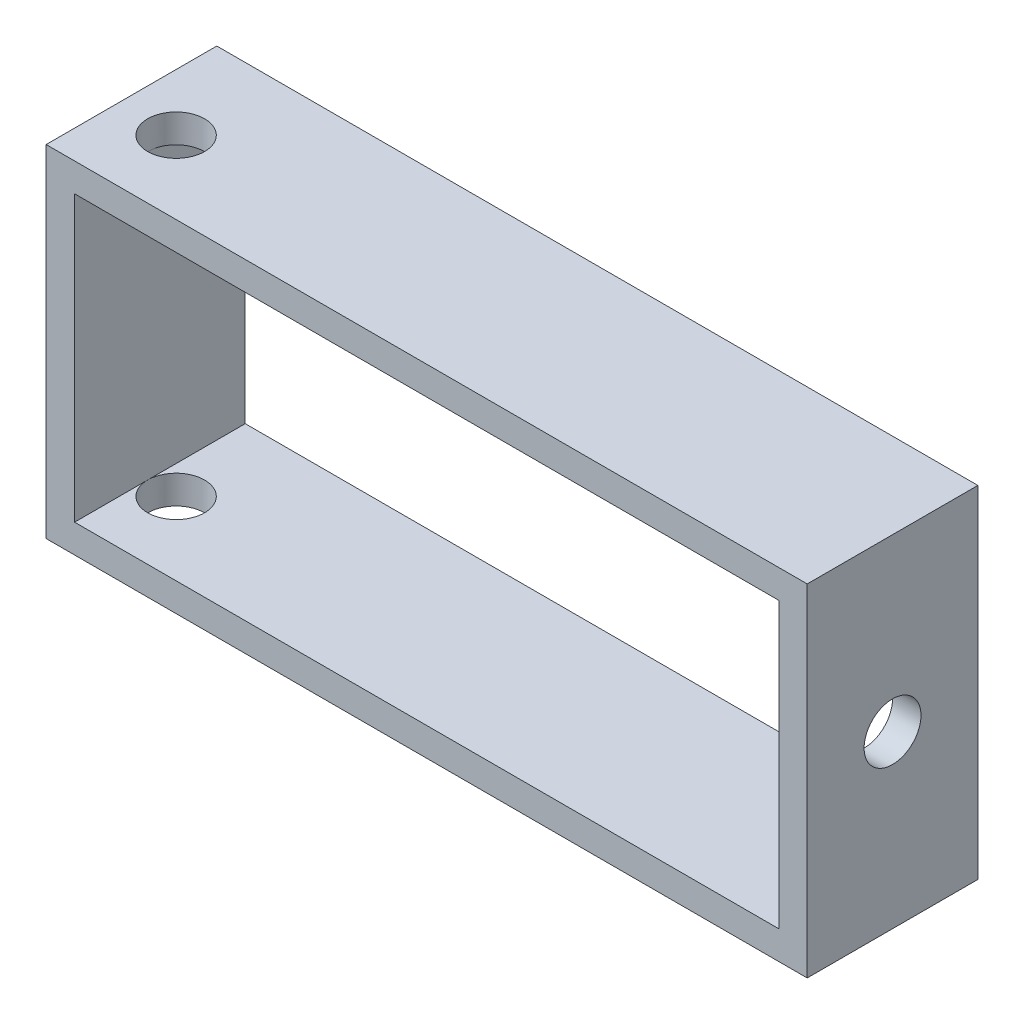
ISO-10303-21;
HEADER;
FILE_DESCRIPTION(('STEP AP214'),'2;1');
FILE_NAME('part.step','',(''),(''),'','','');
FILE_SCHEMA(('AUTOMOTIVE_DESIGN { 1 0 10303 214 1 1 1 1 }'));
ENDSEC;
DATA;
#1=APPLICATION_CONTEXT('core data for automotive mechanical design processes');
#2=APPLICATION_PROTOCOL_DEFINITION('international standard','automotive_design',2000,#1);
#3=PRODUCT_CONTEXT('',#1,'mechanical');
#4=PRODUCT('Part','Part','',(#3));
#5=PRODUCT_RELATED_PRODUCT_CATEGORY('part','',(#4));
#6=PRODUCT_DEFINITION_FORMATION('','',#4);
#7=PRODUCT_DEFINITION_CONTEXT('part definition',#1,'design');
#8=PRODUCT_DEFINITION('design','',#6,#7);
#9=PRODUCT_DEFINITION_SHAPE('','',#8);
#10=(LENGTH_UNIT() NAMED_UNIT(*) SI_UNIT(.MILLI.,.METRE.));
#11=(NAMED_UNIT(*) PLANE_ANGLE_UNIT() SI_UNIT($,.RADIAN.));
#12=(NAMED_UNIT(*) SI_UNIT($,.STERADIAN.) SOLID_ANGLE_UNIT());
#13=UNCERTAINTY_MEASURE_WITH_UNIT(LENGTH_MEASURE(1.E-05),#10,'distance_accuracy_value','');
#14=(GEOMETRIC_REPRESENTATION_CONTEXT(3) GLOBAL_UNCERTAINTY_ASSIGNED_CONTEXT((#13)) GLOBAL_UNIT_ASSIGNED_CONTEXT((#10,
#11,#12)) REPRESENTATION_CONTEXT('',''));
#15=CARTESIAN_POINT('',(0.,0.,0.));
#16=DIRECTION('',(0.,0.,1.));
#17=DIRECTION('',(1.,0.,0.));
#18=AXIS2_PLACEMENT_3D('',#15,#16,#17);
#19=CARTESIAN_POINT('',(-26.5645278612584,60.,-7.49483109232942));
#20=DIRECTION('',(0.,-1.,0.));
#21=DIRECTION('',(0.,0.,-1.));
#22=AXIS2_PLACEMENT_3D('',#19,#20,#21);
#23=CYLINDRICAL_SURFACE('',#22,5.);
#24=CARTESIAN_POINT('',(-26.5645278612584,55.,-7.49483109232942));
#25=DIRECTION('',(0.,1.,0.));
#26=DIRECTION('',(0.,0.,1.));
#27=AXIS2_PLACEMENT_3D('',#24,#25,#26);
#28=CIRCLE('',#27,5.);
#29=CARTESIAN_POINT('',(-31.5645278612584,55.,-7.49483109232942));
#30=VERTEX_POINT('',#29);
#31=EDGE_CURVE('E11',#30,#30,#28,.T.);
#32=ORIENTED_EDGE('',*,*,#31,.F.);
#33=EDGE_LOOP('',(#32));
#34=FACE_BOUND('',#33,.T.);
#35=CARTESIAN_POINT('',(-26.5645278612584,60.,-7.49483109232942));
#36=DIRECTION('',(0.,1.,0.));
#37=DIRECTION('',(0.,0.,1.));
#38=AXIS2_PLACEMENT_3D('',#35,#36,#37);
#39=CIRCLE('',#38,5.);
#40=CARTESIAN_POINT('',(-26.5645278612584,60.,-2.49483109232941));
#41=VERTEX_POINT('',#40);
#42=EDGE_CURVE('E150',#41,#41,#39,.T.);
#43=ORIENTED_EDGE('',*,*,#42,.T.);
#44=EDGE_LOOP('',(#43));
#45=FACE_BOUND('',#44,.T.);
#46=ADVANCED_FACE('F36',(#34,#45),#23,.F.);
#47=CARTESIAN_POINT('',(0.,60.,0.));
#48=DIRECTION('',(0.,-1.,0.));
#49=DIRECTION('',(0.,0.,-1.));
#50=AXIS2_PLACEMENT_3D('',#47,#48,#49);
#51=PLANE('',#50);
#52=DIRECTION('',(0.,0.,1.));
#53=VECTOR('',#52,1.);
#54=CARTESIAN_POINT('',(-36.5645278612584,60.,5.35714285714286));
#55=LINE('',#54,#53);
#56=CARTESIAN_POINT('',(-36.5645278612584,60.,-24.6428571428571));
#57=VERTEX_POINT('',#56);
#58=CARTESIAN_POINT('',(-36.5645278612584,60.,5.35714285714286));
#59=VERTEX_POINT('',#58);
#60=EDGE_CURVE('E156',#57,#59,#55,.T.);
#61=ORIENTED_EDGE('',*,*,#60,.T.);
#62=DIRECTION('',(1.,0.,0.));
#63=VECTOR('',#62,1.);
#64=CARTESIAN_POINT('',(-36.5645278612584,60.,5.35714285714286));
#65=LINE('',#64,#63);
#66=CARTESIAN_POINT('',(97.2354721387416,60.,5.35714285714286));
#67=VERTEX_POINT('',#66);
#68=EDGE_CURVE('E159',#59,#67,#65,.T.);
#69=ORIENTED_EDGE('',*,*,#68,.T.);
#70=DIRECTION('',(0.,0.,-1.));
#71=VECTOR('',#70,1.);
#72=CARTESIAN_POINT('',(97.2354721387416,60.,5.35714285714286));
#73=LINE('',#72,#71);
#74=CARTESIAN_POINT('',(97.2354721387416,60.,-24.6428571428571));
#75=VERTEX_POINT('',#74);
#76=EDGE_CURVE('E162',#67,#75,#73,.T.);
#77=ORIENTED_EDGE('',*,*,#76,.T.);
#78=DIRECTION('',(-1.,0.,0.));
#79=VECTOR('',#78,1.);
#80=CARTESIAN_POINT('',(-36.5645278612584,60.,-24.6428571428571));
#81=LINE('',#80,#79);
#82=EDGE_CURVE('E164',#75,#57,#81,.T.);
#83=ORIENTED_EDGE('',*,*,#82,.T.);
#84=EDGE_LOOP('',(#61,#69,#77,#83));
#85=FACE_BOUND('',#84,.T.);
#86=ORIENTED_EDGE('',*,*,#42,.F.);
#87=EDGE_LOOP('',(#86));
#88=FACE_BOUND('',#87,.T.);
#89=ADVANCED_FACE('F196',(#85,#88),#51,.F.);
#90=CARTESIAN_POINT('',(0.,0.,0.));
#91=DIRECTION('',(0.,-1.,0.));
#92=DIRECTION('',(0.,0.,-1.));
#93=AXIS2_PLACEMENT_3D('',#90,#91,#92);
#94=PLANE('',#93);
#95=DIRECTION('',(0.,0.,1.));
#96=VECTOR('',#95,1.);
#97=CARTESIAN_POINT('',(-36.5645278612584,0.,5.35714285714286));
#98=LINE('',#97,#96);
#99=CARTESIAN_POINT('',(-36.5645278612584,0.,-24.6428571428571));
#100=VERTEX_POINT('',#99);
#101=CARTESIAN_POINT('',(-36.5645278612584,0.,5.35714285714286));
#102=VERTEX_POINT('',#101);
#103=EDGE_CURVE('E153',#100,#102,#98,.T.);
#104=ORIENTED_EDGE('',*,*,#103,.F.);
#105=DIRECTION('',(-1.,0.,0.));
#106=VECTOR('',#105,1.);
#107=CARTESIAN_POINT('',(-36.5645278612584,0.,-24.6428571428571));
#108=LINE('',#107,#106);
#109=CARTESIAN_POINT('',(97.2354721387416,0.,-24.6428571428571));
#110=VERTEX_POINT('',#109);
#111=EDGE_CURVE('E160',#110,#100,#108,.T.);
#112=ORIENTED_EDGE('',*,*,#111,.F.);
#113=DIRECTION('',(0.,0.,-1.));
#114=VECTOR('',#113,1.);
#115=CARTESIAN_POINT('',(97.2354721387416,0.,5.35714285714286));
#116=LINE('',#115,#114);
#117=CARTESIAN_POINT('',(97.2354721387416,0.,5.35714285714286));
#118=VERTEX_POINT('',#117);
#119=EDGE_CURVE('E171',#118,#110,#116,.T.);
#120=ORIENTED_EDGE('',*,*,#119,.F.);
#121=DIRECTION('',(1.,0.,0.));
#122=VECTOR('',#121,1.);
#123=CARTESIAN_POINT('',(-36.5645278612584,0.,5.35714285714286));
#124=LINE('',#123,#122);
#125=EDGE_CURVE('E169',#102,#118,#124,.T.);
#126=ORIENTED_EDGE('',*,*,#125,.F.);
#127=EDGE_LOOP('',(#104,#112,#120,#126));
#128=FACE_BOUND('',#127,.T.);
#129=CARTESIAN_POINT('',(-26.5645278612584,0.,-7.49483109232942));
#130=DIRECTION('',(0.,1.,0.));
#131=DIRECTION('',(0.,0.,1.));
#132=AXIS2_PLACEMENT_3D('',#129,#130,#131);
#133=CIRCLE('',#132,5.);
#134=CARTESIAN_POINT('',(-26.5645278612584,0.,-2.49483109232941));
#135=VERTEX_POINT('',#134);
#136=EDGE_CURVE('E145',#135,#135,#133,.T.);
#137=ORIENTED_EDGE('',*,*,#136,.T.);
#138=EDGE_LOOP('',(#137));
#139=FACE_BOUND('',#138,.T.);
#140=ADVANCED_FACE('F194',(#128,#139),#94,.T.);
#141=CARTESIAN_POINT('',(-36.5645278612584,60.,5.35714285714286));
#142=DIRECTION('',(1.,0.,0.));
#143=DIRECTION('',(0.,0.,-1.));
#144=AXIS2_PLACEMENT_3D('',#141,#142,#143);
#145=PLANE('',#144);
#146=ORIENTED_EDGE('',*,*,#103,.T.);
#147=DIRECTION('',(0.,-1.,0.));
#148=VECTOR('',#147,1.);
#149=CARTESIAN_POINT('',(-36.5645278612584,60.,5.35714285714286));
#150=LINE('',#149,#148);
#151=EDGE_CURVE('E182',#59,#102,#150,.T.);
#152=ORIENTED_EDGE('',*,*,#151,.F.);
#153=ORIENTED_EDGE('',*,*,#60,.F.);
#154=DIRECTION('',(0.,-1.,0.));
#155=VECTOR('',#154,1.);
#156=CARTESIAN_POINT('',(-36.5645278612584,60.,-24.6428571428571));
#157=LINE('',#156,#155);
#158=EDGE_CURVE('E166',#57,#100,#157,.T.);
#159=ORIENTED_EDGE('',*,*,#158,.T.);
#160=EDGE_LOOP('',(#146,#152,#153,#159));
#161=FACE_BOUND('',#160,.T.);
#162=ADVANCED_FACE('F38',(#161),#145,.F.);
#163=CARTESIAN_POINT('',(-36.5645278612584,60.,5.35714285714286));
#164=DIRECTION('',(0.,0.,-1.));
#165=DIRECTION('',(-1.,0.,0.));
#166=AXIS2_PLACEMENT_3D('',#163,#164,#165);
#167=PLANE('',#166);
#168=DIRECTION('',(1.,0.,0.));
#169=VECTOR('',#168,1.);
#170=CARTESIAN_POINT('',(-31.5645278612584,5.,5.35714285714286));
#171=LINE('',#170,#169);
#172=CARTESIAN_POINT('',(-31.5645278612584,5.,5.35714285714286));
#173=VERTEX_POINT('',#172);
#174=CARTESIAN_POINT('',(92.2354721387416,5.,5.35714285714286));
#175=VERTEX_POINT('',#174);
#176=EDGE_CURVE('E139',#173,#175,#171,.T.);
#177=ORIENTED_EDGE('',*,*,#176,.F.);
#178=DIRECTION('',(0.,-1.,0.));
#179=VECTOR('',#178,1.);
#180=CARTESIAN_POINT('',(-31.5645278612584,55.,5.35714285714286));
#181=LINE('',#180,#179);
#182=CARTESIAN_POINT('',(-31.5645278612584,55.,5.35714285714286));
#183=VERTEX_POINT('',#182);
#184=EDGE_CURVE('E52',#183,#173,#181,.T.);
#185=ORIENTED_EDGE('',*,*,#184,.F.);
#186=DIRECTION('',(-1.,0.,0.));
#187=VECTOR('',#186,1.);
#188=CARTESIAN_POINT('',(-31.5645278612584,55.,5.35714285714286));
#189=LINE('',#188,#187);
#190=CARTESIAN_POINT('',(92.2354721387416,55.,5.35714285714286));
#191=VERTEX_POINT('',#190);
#192=EDGE_CURVE('E128',#191,#183,#189,.T.);
#193=ORIENTED_EDGE('',*,*,#192,.F.);
#194=DIRECTION('',(0.,1.,0.));
#195=VECTOR('',#194,1.);
#196=CARTESIAN_POINT('',(92.2354721387416,55.,5.35714285714286));
#197=LINE('',#196,#195);
#198=EDGE_CURVE('E131',#175,#191,#197,.T.);
#199=ORIENTED_EDGE('',*,*,#198,.F.);
#200=EDGE_LOOP('',(#177,#185,#193,#199));
#201=FACE_BOUND('',#200,.T.);
#202=ORIENTED_EDGE('',*,*,#125,.T.);
#203=DIRECTION('',(0.,-1.,0.));
#204=VECTOR('',#203,1.);
#205=CARTESIAN_POINT('',(97.2354721387416,60.,5.35714285714286));
#206=LINE('',#205,#204);
#207=EDGE_CURVE('E179',#67,#118,#206,.T.);
#208=ORIENTED_EDGE('',*,*,#207,.F.);
#209=ORIENTED_EDGE('',*,*,#68,.F.);
#210=ORIENTED_EDGE('',*,*,#151,.T.);
#211=EDGE_LOOP('',(#202,#208,#209,#210));
#212=FACE_BOUND('',#211,.T.);
#213=ADVANCED_FACE('F203',(#201,#212),#167,.F.);
#214=CARTESIAN_POINT('',(97.2354721387416,60.,5.35714285714286));
#215=DIRECTION('',(-1.,0.,0.));
#216=DIRECTION('',(0.,0.,1.));
#217=AXIS2_PLACEMENT_3D('',#214,#215,#216);
#218=PLANE('',#217);
#219=CARTESIAN_POINT('',(97.2354721387416,30.,-9.64285714285714));
#220=DIRECTION('',(1.,0.,0.));
#221=DIRECTION('',(0.,0.,-1.));
#222=AXIS2_PLACEMENT_3D('',#219,#220,#221);
#223=CIRCLE('',#222,5.);
#224=CARTESIAN_POINT('',(97.2354721387416,30.,-14.6428571428571));
#225=VERTEX_POINT('',#224);
#226=EDGE_CURVE('E134',#225,#225,#223,.T.);
#227=ORIENTED_EDGE('',*,*,#226,.F.);
#228=EDGE_LOOP('',(#227));
#229=FACE_BOUND('',#228,.T.);
#230=ORIENTED_EDGE('',*,*,#119,.T.);
#231=DIRECTION('',(0.,-1.,0.));
#232=VECTOR('',#231,1.);
#233=CARTESIAN_POINT('',(97.2354721387416,60.,-24.6428571428571));
#234=LINE('',#233,#232);
#235=EDGE_CURVE('E176',#75,#110,#234,.T.);
#236=ORIENTED_EDGE('',*,*,#235,.F.);
#237=ORIENTED_EDGE('',*,*,#76,.F.);
#238=ORIENTED_EDGE('',*,*,#207,.T.);
#239=EDGE_LOOP('',(#230,#236,#237,#238));
#240=FACE_BOUND('',#239,.T.);
#241=ADVANCED_FACE('F244',(#229,#240),#218,.F.);
#242=CARTESIAN_POINT('',(-36.5645278612584,60.,-24.6428571428571));
#243=DIRECTION('',(0.,0.,1.));
#244=DIRECTION('',(1.,0.,0.));
#245=AXIS2_PLACEMENT_3D('',#242,#243,#244);
#246=PLANE('',#245);
#247=DIRECTION('',(-1.,0.,0.));
#248=VECTOR('',#247,1.);
#249=CARTESIAN_POINT('',(-31.5645278612584,55.,-24.6428571428571));
#250=LINE('',#249,#248);
#251=CARTESIAN_POINT('',(92.2354721387416,55.,-24.6428571428571));
#252=VERTEX_POINT('',#251);
#253=CARTESIAN_POINT('',(-31.5645278612584,55.,-24.6428571428571));
#254=VERTEX_POINT('',#253);
#255=EDGE_CURVE('E127',#252,#254,#250,.T.);
#256=ORIENTED_EDGE('',*,*,#255,.T.);
#257=DIRECTION('',(0.,-1.,0.));
#258=VECTOR('',#257,1.);
#259=CARTESIAN_POINT('',(-31.5645278612584,55.,-24.6428571428571));
#260=LINE('',#259,#258);
#261=CARTESIAN_POINT('',(-31.5645278612584,5.,-24.6428571428571));
#262=VERTEX_POINT('',#261);
#263=EDGE_CURVE('E111',#254,#262,#260,.T.);
#264=ORIENTED_EDGE('',*,*,#263,.T.);
#265=DIRECTION('',(1.,0.,0.));
#266=VECTOR('',#265,1.);
#267=CARTESIAN_POINT('',(-31.5645278612584,5.,-24.6428571428571));
#268=LINE('',#267,#266);
#269=CARTESIAN_POINT('',(92.2354721387416,4.99999999999999,-24.6428571428571));
#270=VERTEX_POINT('',#269);
#271=EDGE_CURVE('E119',#262,#270,#268,.T.);
#272=ORIENTED_EDGE('',*,*,#271,.T.);
#273=DIRECTION('',(0.,1.,0.));
#274=VECTOR('',#273,1.);
#275=CARTESIAN_POINT('',(92.2354721387416,55.,-24.6428571428571));
#276=LINE('',#275,#274);
#277=EDGE_CURVE('E60',#270,#252,#276,.T.);
#278=ORIENTED_EDGE('',*,*,#277,.T.);
#279=EDGE_LOOP('',(#256,#264,#272,#278));
#280=FACE_BOUND('',#279,.T.);
#281=ORIENTED_EDGE('',*,*,#111,.T.);
#282=ORIENTED_EDGE('',*,*,#158,.F.);
#283=ORIENTED_EDGE('',*,*,#82,.F.);
#284=ORIENTED_EDGE('',*,*,#235,.T.);
#285=EDGE_LOOP('',(#281,#282,#283,#284));
#286=FACE_BOUND('',#285,.T.);
#287=ADVANCED_FACE('F124',(#280,#286),#246,.F.);
#288=CARTESIAN_POINT('',(-26.5645278612584,5.,-7.49483109232942));
#289=DIRECTION('',(0.,-1.,0.));
#290=DIRECTION('',(1.,0.,0.));
#291=AXIS2_PLACEMENT_3D('',#288,#289,#290);
#292=CIRCLE('',#291,5.);
#293=CARTESIAN_POINT('',(-31.5645278612584,5.,-7.49483109232942));
#294=VERTEX_POINT('',#293);
#295=EDGE_CURVE('E45',#294,#294,#292,.T.);
#296=ORIENTED_EDGE('',*,*,#295,.F.);
#297=EDGE_LOOP('',(#296));
#298=FACE_BOUND('',#297,.T.);
#299=ORIENTED_EDGE('',*,*,#136,.F.);
#300=EDGE_LOOP('',(#299));
#301=FACE_BOUND('',#300,.T.);
#302=ADVANCED_FACE('F188',(#298,#301),#23,.F.);
#303=CARTESIAN_POINT('',(-31.5645278612584,55.,-24.6428571428571));
#304=DIRECTION('',(-1.,0.,0.));
#305=DIRECTION('',(0.,-1.,0.));
#306=AXIS2_PLACEMENT_3D('',#303,#304,#305);
#307=PLANE('',#306);
#308=DIRECTION('',(0.,0.,1.));
#309=VECTOR('',#308,1.);
#310=CARTESIAN_POINT('',(-31.5645278612584,55.,-24.6428571428571));
#311=LINE('',#310,#309);
#312=EDGE_CURVE('E146',#30,#183,#311,.T.);
#313=ORIENTED_EDGE('',*,*,#312,.T.);
#314=ORIENTED_EDGE('',*,*,#184,.T.);
#315=DIRECTION('',(0.,0.,1.));
#316=VECTOR('',#315,1.);
#317=CARTESIAN_POINT('',(-31.5645278612584,5.,-24.6428571428571));
#318=LINE('',#317,#316);
#319=EDGE_CURVE('E113',#294,#173,#318,.T.);
#320=ORIENTED_EDGE('',*,*,#319,.F.);
#321=EDGE_CURVE('E107',#262,#294,#318,.T.);
#322=ORIENTED_EDGE('',*,*,#321,.F.);
#323=ORIENTED_EDGE('',*,*,#263,.F.);
#324=EDGE_CURVE('E143',#254,#30,#311,.T.);
#325=ORIENTED_EDGE('',*,*,#324,.T.);
#326=EDGE_LOOP('',(#313,#314,#320,#322,#323,#325));
#327=FACE_BOUND('',#326,.T.);
#328=ADVANCED_FACE('F109',(#327),#307,.F.);
#329=CARTESIAN_POINT('',(-31.5645278612584,55.,-24.6428571428571));
#330=DIRECTION('',(0.,1.,0.));
#331=DIRECTION('',(0.,0.,1.));
#332=AXIS2_PLACEMENT_3D('',#329,#330,#331);
#333=PLANE('',#332);
#334=ORIENTED_EDGE('',*,*,#324,.F.);
#335=ORIENTED_EDGE('',*,*,#255,.F.);
#336=DIRECTION('',(0.,0.,1.));
#337=VECTOR('',#336,1.);
#338=CARTESIAN_POINT('',(92.2354721387416,55.,-24.6428571428571));
#339=LINE('',#338,#337);
#340=EDGE_CURVE('E147',#252,#191,#339,.T.);
#341=ORIENTED_EDGE('',*,*,#340,.T.);
#342=ORIENTED_EDGE('',*,*,#192,.T.);
#343=ORIENTED_EDGE('',*,*,#312,.F.);
#344=ORIENTED_EDGE('',*,*,#31,.T.);
#345=EDGE_LOOP('',(#334,#335,#341,#342,#343,#344));
#346=FACE_BOUND('',#345,.T.);
#347=ADVANCED_FACE('F218',(#346),#333,.F.);
#348=CARTESIAN_POINT('',(92.2354721387416,55.,-24.6428571428571));
#349=DIRECTION('',(1.,0.,0.));
#350=DIRECTION('',(0.,0.,-1.));
#351=AXIS2_PLACEMENT_3D('',#348,#349,#350);
#352=PLANE('',#351);
#353=CARTESIAN_POINT('',(92.2354721387416,30.,-9.64285714285714));
#354=DIRECTION('',(1.,0.,0.));
#355=DIRECTION('',(0.,0.,-1.));
#356=AXIS2_PLACEMENT_3D('',#353,#354,#355);
#357=CIRCLE('',#356,5.);
#358=CARTESIAN_POINT('',(92.2354721387416,30.,-14.6428571428571));
#359=VERTEX_POINT('',#358);
#360=EDGE_CURVE('E40',#359,#359,#357,.T.);
#361=ORIENTED_EDGE('',*,*,#360,.T.);
#362=EDGE_LOOP('',(#361));
#363=FACE_BOUND('',#362,.T.);
#364=ORIENTED_EDGE('',*,*,#198,.T.);
#365=ORIENTED_EDGE('',*,*,#340,.F.);
#366=ORIENTED_EDGE('',*,*,#277,.F.);
#367=DIRECTION('',(0.,0.,1.));
#368=VECTOR('',#367,1.);
#369=CARTESIAN_POINT('',(92.2354721387416,5.,-24.6428571428571));
#370=LINE('',#369,#368);
#371=EDGE_CURVE('E116',#270,#175,#370,.T.);
#372=ORIENTED_EDGE('',*,*,#371,.T.);
#373=EDGE_LOOP('',(#364,#365,#366,#372));
#374=FACE_BOUND('',#373,.T.);
#375=ADVANCED_FACE('F222',(#363,#374),#352,.F.);
#376=CARTESIAN_POINT('',(-31.5645278612584,5.,-24.6428571428571));
#377=DIRECTION('',(0.,-1.,0.));
#378=DIRECTION('',(1.,0.,0.));
#379=AXIS2_PLACEMENT_3D('',#376,#377,#378);
#380=PLANE('',#379);
#381=ORIENTED_EDGE('',*,*,#319,.T.);
#382=ORIENTED_EDGE('',*,*,#176,.T.);
#383=ORIENTED_EDGE('',*,*,#371,.F.);
#384=ORIENTED_EDGE('',*,*,#271,.F.);
#385=ORIENTED_EDGE('',*,*,#321,.T.);
#386=ORIENTED_EDGE('',*,*,#295,.T.);
#387=EDGE_LOOP('',(#381,#382,#383,#384,#385,#386));
#388=FACE_BOUND('',#387,.T.);
#389=ADVANCED_FACE('F120',(#388),#380,.F.);
#390=CARTESIAN_POINT('',(87.2354721387416,30.,-9.64285714285714));
#391=DIRECTION('',(1.,0.,0.));
#392=DIRECTION('',(0.,0.,-1.));
#393=AXIS2_PLACEMENT_3D('',#390,#391,#392);
#394=CYLINDRICAL_SURFACE('',#393,5.);
#395=ORIENTED_EDGE('',*,*,#226,.T.);
#396=EDGE_LOOP('',(#395));
#397=FACE_BOUND('',#396,.T.);
#398=ORIENTED_EDGE('',*,*,#360,.F.);
#399=EDGE_LOOP('',(#398));
#400=FACE_BOUND('',#399,.T.);
#401=ADVANCED_FACE('F221',(#397,#400),#394,.F.);
#402=CLOSED_SHELL('',(#46,#89,#140,#162,#213,#241,#287,#302,#328,#347,#375,#389,#401));
#403=MANIFOLD_SOLID_BREP('B2',#402);
#404=ADVANCED_BREP_SHAPE_REPRESENTATION('',(#18,#403),#14);
#405=SHAPE_DEFINITION_REPRESENTATION(#9,#404);
ENDSEC;
END-ISO-10303-21;
